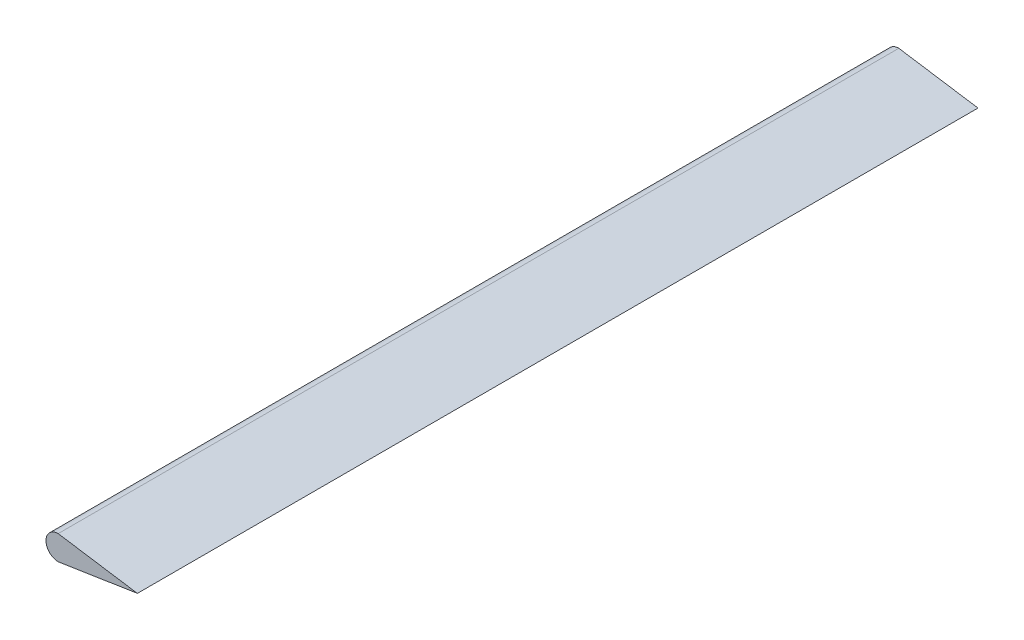
ISO-10303-21;
HEADER;
FILE_DESCRIPTION(('STEP AP214'),'2;1');
FILE_NAME('part.step','',(''),(''),'','','');
FILE_SCHEMA(('AUTOMOTIVE_DESIGN { 1 0 10303 214 1 1 1 1 }'));
ENDSEC;
DATA;
#1=APPLICATION_CONTEXT('core data for automotive mechanical design processes');
#2=APPLICATION_PROTOCOL_DEFINITION('international standard','automotive_design',2000,#1);
#3=PRODUCT_CONTEXT('',#1,'mechanical');
#4=PRODUCT('Part','Part','',(#3));
#5=PRODUCT_RELATED_PRODUCT_CATEGORY('part','',(#4));
#6=PRODUCT_DEFINITION_FORMATION('','',#4);
#7=PRODUCT_DEFINITION_CONTEXT('part definition',#1,'design');
#8=PRODUCT_DEFINITION('design','',#6,#7);
#9=PRODUCT_DEFINITION_SHAPE('','',#8);
#10=(LENGTH_UNIT() NAMED_UNIT(*) SI_UNIT(.MILLI.,.METRE.));
#11=(NAMED_UNIT(*) PLANE_ANGLE_UNIT() SI_UNIT($,.RADIAN.));
#12=(NAMED_UNIT(*) SI_UNIT($,.STERADIAN.) SOLID_ANGLE_UNIT());
#13=UNCERTAINTY_MEASURE_WITH_UNIT(LENGTH_MEASURE(1.E-05),#10,'distance_accuracy_value','');
#14=(GEOMETRIC_REPRESENTATION_CONTEXT(3) GLOBAL_UNCERTAINTY_ASSIGNED_CONTEXT((#13)) GLOBAL_UNIT_ASSIGNED_CONTEXT((#10,
#11,#12)) REPRESENTATION_CONTEXT('',''));
#15=CARTESIAN_POINT('',(0.,0.,0.));
#16=DIRECTION('',(0.,0.,1.));
#17=DIRECTION('',(1.,0.,0.));
#18=AXIS2_PLACEMENT_3D('',#15,#16,#17);
#19=CARTESIAN_POINT('',(200.,0.,13800.));
#20=DIRECTION('',(0.,0.,-1.));
#21=DIRECTION('',(-1.,0.,0.));
#22=AXIS2_PLACEMENT_3D('',#19,#20,#21);
#23=CYLINDRICAL_SURFACE('',#22,200.);
#24=CARTESIAN_POINT('',(200.,0.,0.));
#25=DIRECTION('',(0.,0.,1.));
#26=DIRECTION('',(1.,0.,0.));
#27=AXIS2_PLACEMENT_3D('',#24,#25,#26);
#28=CIRCLE('',#27,200.);
#29=CARTESIAN_POINT('',(200.,200.,0.));
#30=VERTEX_POINT('',#29);
#31=CARTESIAN_POINT('',(200.,-200.,0.));
#32=VERTEX_POINT('',#31);
#33=EDGE_CURVE('E83',#30,#32,#28,.T.);
#34=ORIENTED_EDGE('',*,*,#33,.T.);
#35=DIRECTION('',(0.,0.,-1.));
#36=VECTOR('',#35,1.);
#37=CARTESIAN_POINT('',(200.,-200.,13800.));
#38=LINE('',#37,#36);
#39=CARTESIAN_POINT('',(200.,-200.,13800.));
#40=VERTEX_POINT('',#39);
#41=EDGE_CURVE('E11',#40,#32,#38,.T.);
#42=ORIENTED_EDGE('',*,*,#41,.F.);
#43=CARTESIAN_POINT('',(200.,0.,13800.));
#44=DIRECTION('',(0.,0.,1.));
#45=DIRECTION('',(1.,0.,0.));
#46=AXIS2_PLACEMENT_3D('',#43,#44,#45);
#47=CIRCLE('',#46,200.);
#48=CARTESIAN_POINT('',(200.,200.,13800.));
#49=VERTEX_POINT('',#48);
#50=EDGE_CURVE('E74',#49,#40,#47,.T.);
#51=ORIENTED_EDGE('',*,*,#50,.F.);
#52=DIRECTION('',(0.,0.,-1.));
#53=VECTOR('',#52,1.);
#54=CARTESIAN_POINT('',(200.,200.,13800.));
#55=LINE('',#54,#53);
#56=EDGE_CURVE('E56',#49,#30,#55,.T.);
#57=ORIENTED_EDGE('',*,*,#56,.T.);
#58=EDGE_LOOP('',(#34,#42,#51,#57));
#59=FACE_BOUND('',#58,.T.);
#60=ADVANCED_FACE('F39',(#59),#23,.T.);
#61=CARTESIAN_POINT('',(1500.,0.,13800.));
#62=DIRECTION('',(0.152057184253941,-0.988371697650617,0.));
#63=DIRECTION('',(0.988371697650617,0.152057184253941,0.));
#64=AXIS2_PLACEMENT_3D('',#61,#62,#63);
#65=PLANE('',#64);
#66=DIRECTION('',(-0.988371697650617,-0.152057184253941,0.));
#67=VECTOR('',#66,1.);
#68=CARTESIAN_POINT('',(1500.,0.,0.));
#69=LINE('',#68,#67);
#70=CARTESIAN_POINT('',(1500.,0.,0.));
#71=VERTEX_POINT('',#70);
#72=EDGE_CURVE('E94',#71,#32,#69,.T.);
#73=ORIENTED_EDGE('',*,*,#72,.F.);
#74=DIRECTION('',(0.,0.,-1.));
#75=VECTOR('',#74,1.);
#76=CARTESIAN_POINT('',(1500.,0.,13800.));
#77=LINE('',#76,#75);
#78=CARTESIAN_POINT('',(1500.,0.,13800.));
#79=VERTEX_POINT('',#78);
#80=EDGE_CURVE('E48',#79,#71,#77,.T.);
#81=ORIENTED_EDGE('',*,*,#80,.F.);
#82=DIRECTION('',(-0.988371697650617,-0.152057184253941,0.));
#83=VECTOR('',#82,1.);
#84=CARTESIAN_POINT('',(1500.,0.,13800.));
#85=LINE('',#84,#83);
#86=EDGE_CURVE('E78',#79,#40,#85,.T.);
#87=ORIENTED_EDGE('',*,*,#86,.T.);
#88=ORIENTED_EDGE('',*,*,#41,.T.);
#89=EDGE_LOOP('',(#73,#81,#87,#88));
#90=FACE_BOUND('',#89,.T.);
#91=ADVANCED_FACE('F86',(#90),#65,.T.);
#92=CARTESIAN_POINT('',(200.,200.,13800.));
#93=DIRECTION('',(0.152057184253941,0.988371697650617,0.));
#94=DIRECTION('',(-0.988371697650617,0.152057184253941,0.));
#95=AXIS2_PLACEMENT_3D('',#92,#93,#94);
#96=PLANE('',#95);
#97=DIRECTION('',(0.988371697650617,-0.152057184253941,0.));
#98=VECTOR('',#97,1.);
#99=CARTESIAN_POINT('',(200.,200.,0.));
#100=LINE('',#99,#98);
#101=EDGE_CURVE('E81',#30,#71,#100,.T.);
#102=ORIENTED_EDGE('',*,*,#101,.F.);
#103=ORIENTED_EDGE('',*,*,#56,.F.);
#104=DIRECTION('',(0.988371697650617,-0.152057184253941,0.));
#105=VECTOR('',#104,1.);
#106=CARTESIAN_POINT('',(200.,200.,13800.));
#107=LINE('',#106,#105);
#108=EDGE_CURVE('E79',#49,#79,#107,.T.);
#109=ORIENTED_EDGE('',*,*,#108,.T.);
#110=ORIENTED_EDGE('',*,*,#80,.T.);
#111=EDGE_LOOP('',(#102,#103,#109,#110));
#112=FACE_BOUND('',#111,.T.);
#113=ADVANCED_FACE('F104',(#112),#96,.T.);
#114=CARTESIAN_POINT('',(200.,0.,13800.));
#115=DIRECTION('',(0.,0.,1.));
#116=DIRECTION('',(1.,0.,0.));
#117=AXIS2_PLACEMENT_3D('',#114,#115,#116);
#118=PLANE('',#117);
#119=ORIENTED_EDGE('',*,*,#50,.T.);
#120=ORIENTED_EDGE('',*,*,#86,.F.);
#121=ORIENTED_EDGE('',*,*,#108,.F.);
#122=EDGE_LOOP('',(#119,#120,#121));
#123=FACE_BOUND('',#122,.T.);
#124=ADVANCED_FACE('F76',(#123),#118,.T.);
#125=CARTESIAN_POINT('',(200.,0.,0.));
#126=DIRECTION('',(0.,0.,1.));
#127=DIRECTION('',(1.,0.,0.));
#128=AXIS2_PLACEMENT_3D('',#125,#126,#127);
#129=PLANE('',#128);
#130=ORIENTED_EDGE('',*,*,#33,.F.);
#131=ORIENTED_EDGE('',*,*,#101,.T.);
#132=ORIENTED_EDGE('',*,*,#72,.T.);
#133=EDGE_LOOP('',(#130,#131,#132));
#134=FACE_BOUND('',#133,.T.);
#135=ADVANCED_FACE('F103',(#134),#129,.F.);
#136=CLOSED_SHELL('',(#60,#91,#113,#124,#135));
#137=MANIFOLD_SOLID_BREP('B2',#136);
#138=ADVANCED_BREP_SHAPE_REPRESENTATION('',(#18,#137),#14);
#139=SHAPE_DEFINITION_REPRESENTATION(#9,#138);
ENDSEC;
END-ISO-10303-21;
